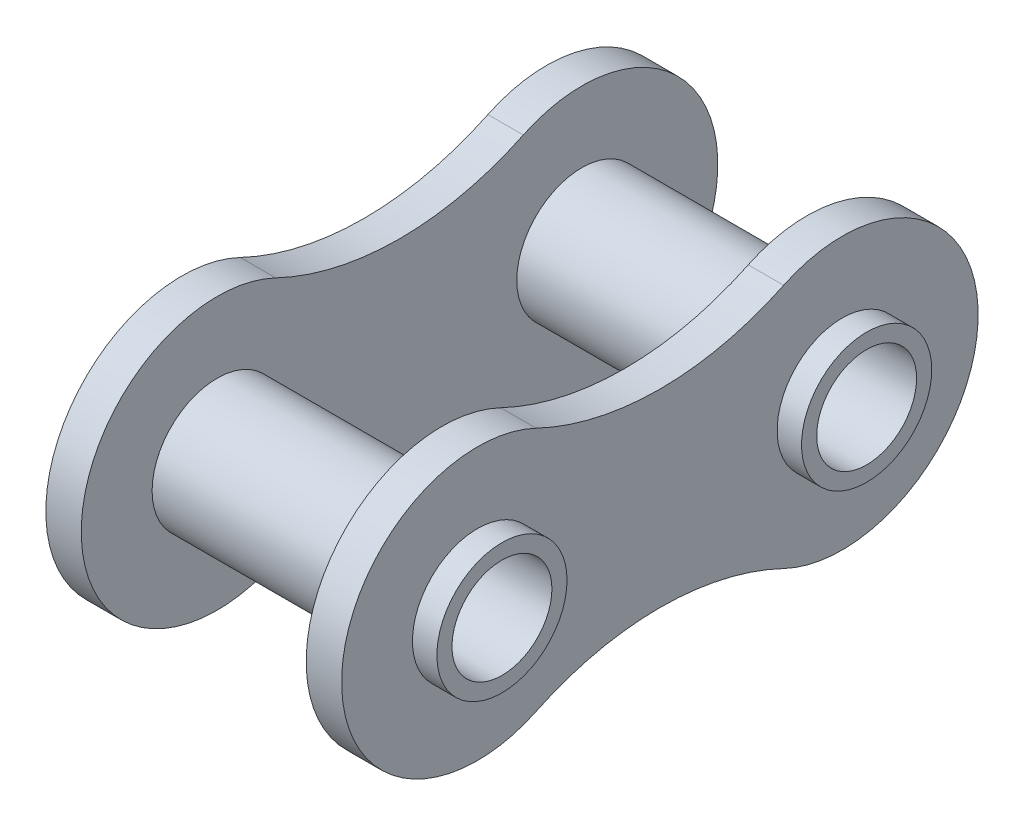
ISO-10303-21;
HEADER;
FILE_DESCRIPTION(('STEP AP214'),'2;1');
FILE_NAME('part.step','',(''),(''),'','','');
FILE_SCHEMA(('AUTOMOTIVE_DESIGN { 1 0 10303 214 1 1 1 1 }'));
ENDSEC;
DATA;
#1=APPLICATION_CONTEXT('core data for automotive mechanical design processes');
#2=APPLICATION_PROTOCOL_DEFINITION('international standard','automotive_design',2000,#1);
#3=PRODUCT_CONTEXT('',#1,'mechanical');
#4=PRODUCT('Part','Part','',(#3));
#5=PRODUCT_RELATED_PRODUCT_CATEGORY('part','',(#4));
#6=PRODUCT_DEFINITION_FORMATION('','',#4);
#7=PRODUCT_DEFINITION_CONTEXT('part definition',#1,'design');
#8=PRODUCT_DEFINITION('design','',#6,#7);
#9=PRODUCT_DEFINITION_SHAPE('','',#8);
#10=(LENGTH_UNIT() NAMED_UNIT(*) SI_UNIT(.MILLI.,.METRE.));
#11=(NAMED_UNIT(*) PLANE_ANGLE_UNIT() SI_UNIT($,.RADIAN.));
#12=(NAMED_UNIT(*) SI_UNIT($,.STERADIAN.) SOLID_ANGLE_UNIT());
#13=UNCERTAINTY_MEASURE_WITH_UNIT(LENGTH_MEASURE(1.E-05),#10,'distance_accuracy_value','');
#14=(GEOMETRIC_REPRESENTATION_CONTEXT(3) GLOBAL_UNCERTAINTY_ASSIGNED_CONTEXT((#13)) GLOBAL_UNIT_ASSIGNED_CONTEXT((#10,
#11,#12)) REPRESENTATION_CONTEXT('',''));
#15=CARTESIAN_POINT('',(0.,0.,0.));
#16=DIRECTION('',(0.,0.,1.));
#17=DIRECTION('',(1.,0.,0.));
#18=AXIS2_PLACEMENT_3D('',#15,#16,#17);
#19=CARTESIAN_POINT('',(18.,0.,19.05));
#20=DIRECTION('',(-1.,0.,0.));
#21=DIRECTION('',(0.,0.,1.));
#22=AXIS2_PLACEMENT_3D('',#19,#20,#21);
#23=CYLINDRICAL_SURFACE('',#22,6.8);
#24=CARTESIAN_POINT('',(11.75,0.,19.05));
#25=DIRECTION('',(1.,0.,0.));
#26=DIRECTION('',(0.,0.,-1.));
#27=AXIS2_PLACEMENT_3D('',#24,#25,#26);
#28=CIRCLE('',#27,6.8);
#29=CARTESIAN_POINT('',(11.75,0.,12.25));
#30=VERTEX_POINT('',#29);
#31=EDGE_CURVE('E215',#30,#30,#28,.T.);
#32=ORIENTED_EDGE('',*,*,#31,.F.);
#33=EDGE_LOOP('',(#32));
#34=FACE_BOUND('',#33,.T.);
#35=CARTESIAN_POINT('',(-11.75,0.,19.05));
#36=DIRECTION('',(-1.,0.,0.));
#37=DIRECTION('',(0.,0.,1.));
#38=AXIS2_PLACEMENT_3D('',#35,#36,#37);
#39=CIRCLE('',#38,6.8);
#40=CARTESIAN_POINT('',(-11.75,0.,25.85));
#41=VERTEX_POINT('',#40);
#42=EDGE_CURVE('E11',#41,#41,#39,.T.);
#43=ORIENTED_EDGE('',*,*,#42,.F.);
#44=EDGE_LOOP('',(#43));
#45=FACE_BOUND('',#44,.T.);
#46=ADVANCED_FACE('F43',(#34,#45),#23,.T.);
#47=CARTESIAN_POINT('',(18.,0.,-19.05));
#48=DIRECTION('',(-1.,0.,0.));
#49=DIRECTION('',(0.,0.,1.));
#50=AXIS2_PLACEMENT_3D('',#47,#48,#49);
#51=CYLINDRICAL_SURFACE('',#50,6.8);
#52=CARTESIAN_POINT('',(11.75,0.,-19.05));
#53=DIRECTION('',(1.,0.,0.));
#54=DIRECTION('',(0.,0.,-1.));
#55=AXIS2_PLACEMENT_3D('',#52,#53,#54);
#56=CIRCLE('',#55,6.8);
#57=CARTESIAN_POINT('',(11.75,0.,-25.85));
#58=VERTEX_POINT('',#57);
#59=EDGE_CURVE('E173',#58,#58,#56,.F.);
#60=ORIENTED_EDGE('',*,*,#59,.T.);
#61=EDGE_LOOP('',(#60));
#62=FACE_BOUND('',#61,.T.);
#63=CARTESIAN_POINT('',(-11.75,0.,-19.05));
#64=DIRECTION('',(-1.,0.,0.));
#65=DIRECTION('',(0.,0.,1.));
#66=AXIS2_PLACEMENT_3D('',#63,#64,#65);
#67=CIRCLE('',#66,6.8);
#68=CARTESIAN_POINT('',(-11.75,0.,-12.25));
#69=VERTEX_POINT('',#68);
#70=EDGE_CURVE('E52',#69,#69,#67,.T.);
#71=ORIENTED_EDGE('',*,*,#70,.F.);
#72=EDGE_LOOP('',(#71));
#73=FACE_BOUND('',#72,.T.);
#74=ADVANCED_FACE('F225',(#62,#73),#51,.T.);
#75=CARTESIAN_POINT('',(-15.45,0.,19.05));
#76=DIRECTION('',(1.,0.,0.));
#77=DIRECTION('',(0.,0.,-1.));
#78=AXIS2_PLACEMENT_3D('',#75,#76,#77);
#79=CIRCLE('',#78,6.8);
#80=CARTESIAN_POINT('',(-15.45,0.,12.25));
#81=VERTEX_POINT('',#80);
#82=EDGE_CURVE('E153',#81,#81,#79,.T.);
#83=ORIENTED_EDGE('',*,*,#82,.F.);
#84=EDGE_LOOP('',(#83));
#85=FACE_BOUND('',#84,.T.);
#86=CARTESIAN_POINT('',(-18.,0.,19.05));
#87=DIRECTION('',(1.,0.,0.));
#88=DIRECTION('',(0.,0.,-1.));
#89=AXIS2_PLACEMENT_3D('',#86,#87,#88);
#90=CIRCLE('',#89,6.8);
#91=CARTESIAN_POINT('',(-18.,0.,12.25));
#92=VERTEX_POINT('',#91);
#93=EDGE_CURVE('E209',#92,#92,#90,.T.);
#94=ORIENTED_EDGE('',*,*,#93,.T.);
#95=EDGE_LOOP('',(#94));
#96=FACE_BOUND('',#95,.T.);
#97=ADVANCED_FACE('F227',(#85,#96),#23,.T.);
#98=CARTESIAN_POINT('',(18.,0.,19.05));
#99=DIRECTION('',(1.,0.,0.));
#100=DIRECTION('',(0.,0.,-1.));
#101=AXIS2_PLACEMENT_3D('',#98,#99,#100);
#102=PLANE('',#101);
#103=CARTESIAN_POINT('',(18.,0.,19.05));
#104=DIRECTION('',(1.,0.,0.));
#105=DIRECTION('',(0.,0.,-1.));
#106=AXIS2_PLACEMENT_3D('',#103,#104,#105);
#107=CIRCLE('',#106,6.8);
#108=CARTESIAN_POINT('',(18.,0.,12.25));
#109=VERTEX_POINT('',#108);
#110=EDGE_CURVE('E212',#109,#109,#107,.T.);
#111=ORIENTED_EDGE('',*,*,#110,.T.);
#112=EDGE_LOOP('',(#111));
#113=FACE_BOUND('',#112,.T.);
#114=CARTESIAN_POINT('',(18.,0.,19.05));
#115=DIRECTION('',(1.,0.,0.));
#116=DIRECTION('',(0.,0.,-1.));
#117=AXIS2_PLACEMENT_3D('',#114,#115,#116);
#118=CIRCLE('',#117,5.22);
#119=CARTESIAN_POINT('',(18.,0.,13.83));
#120=VERTEX_POINT('',#119);
#121=EDGE_CURVE('E206',#120,#120,#118,.T.);
#122=ORIENTED_EDGE('',*,*,#121,.F.);
#123=EDGE_LOOP('',(#122));
#124=FACE_BOUND('',#123,.T.);
#125=ADVANCED_FACE('F236',(#113,#124),#102,.T.);
#126=CARTESIAN_POINT('',(-18.,0.,19.05));
#127=DIRECTION('',(1.,0.,0.));
#128=DIRECTION('',(0.,0.,-1.));
#129=AXIS2_PLACEMENT_3D('',#126,#127,#128);
#130=PLANE('',#129);
#131=ORIENTED_EDGE('',*,*,#93,.F.);
#132=EDGE_LOOP('',(#131));
#133=FACE_BOUND('',#132,.T.);
#134=CARTESIAN_POINT('',(-18.,0.,19.05));
#135=DIRECTION('',(1.,0.,0.));
#136=DIRECTION('',(0.,0.,-1.));
#137=AXIS2_PLACEMENT_3D('',#134,#135,#136);
#138=CIRCLE('',#137,5.22);
#139=CARTESIAN_POINT('',(-18.,0.,13.83));
#140=VERTEX_POINT('',#139);
#141=EDGE_CURVE('E205',#140,#140,#138,.T.);
#142=ORIENTED_EDGE('',*,*,#141,.T.);
#143=EDGE_LOOP('',(#142));
#144=FACE_BOUND('',#143,.T.);
#145=ADVANCED_FACE('F295',(#133,#144),#130,.F.);
#146=CARTESIAN_POINT('',(15.45,0.,19.05));
#147=DIRECTION('',(1.,0.,0.));
#148=DIRECTION('',(0.,0.,-1.));
#149=AXIS2_PLACEMENT_3D('',#146,#147,#148);
#150=CIRCLE('',#149,6.8);
#151=CARTESIAN_POINT('',(15.45,0.,12.25));
#152=VERTEX_POINT('',#151);
#153=EDGE_CURVE('E181',#152,#152,#150,.T.);
#154=ORIENTED_EDGE('',*,*,#153,.T.);
#155=EDGE_LOOP('',(#154));
#156=FACE_BOUND('',#155,.T.);
#157=ORIENTED_EDGE('',*,*,#110,.F.);
#158=EDGE_LOOP('',(#157));
#159=FACE_BOUND('',#158,.T.);
#160=ADVANCED_FACE('F45',(#156,#159),#23,.T.);
#161=CARTESIAN_POINT('',(18.,0.,19.05));
#162=DIRECTION('',(-1.,0.,0.));
#163=DIRECTION('',(0.,0.,1.));
#164=AXIS2_PLACEMENT_3D('',#161,#162,#163);
#165=CYLINDRICAL_SURFACE('',#164,5.22);
#166=ORIENTED_EDGE('',*,*,#121,.T.);
#167=EDGE_LOOP('',(#166));
#168=FACE_BOUND('',#167,.T.);
#169=ORIENTED_EDGE('',*,*,#141,.F.);
#170=EDGE_LOOP('',(#169));
#171=FACE_BOUND('',#170,.T.);
#172=ADVANCED_FACE('F275',(#168,#171),#165,.F.);
#173=CARTESIAN_POINT('',(15.45,-19.9420253484946,9.525));
#174=DIRECTION('',(1.,0.,0.));
#175=DIRECTION('',(0.,0.,-1.));
#176=AXIS2_PLACEMENT_3D('',#173,#174,#175);
#177=PLANE('',#176);
#178=ORIENTED_EDGE('',*,*,#153,.F.);
#179=EDGE_LOOP('',(#178));
#180=FACE_BOUND('',#179,.T.);
#181=CARTESIAN_POINT('',(15.45,-39.8840506969891,0.));
#182=DIRECTION('',(-1.,0.,0.));
#183=DIRECTION('',(0.,0.,-1.));
#184=AXIS2_PLACEMENT_3D('',#181,#182,#183);
#185=CIRCLE('',#184,30.);
#186=CARTESIAN_POINT('',(15.45,-12.8134280519739,12.9298642533937));
#187=VERTEX_POINT('',#186);
#188=CARTESIAN_POINT('',(15.45,-12.8134280519739,-12.9298642533937));
#189=VERTEX_POINT('',#188);
#190=EDGE_CURVE('E185',#187,#189,#185,.T.);
#191=ORIENTED_EDGE('',*,*,#190,.T.);
#192=CARTESIAN_POINT('',(15.45,0.,-19.05));
#193=DIRECTION('',(1.,0.,0.));
#194=DIRECTION('',(0.,0.,-1.));
#195=AXIS2_PLACEMENT_3D('',#192,#193,#194);
#196=CIRCLE('',#195,14.2);
#197=CARTESIAN_POINT('',(15.45,12.8134280519739,-12.9298642533937));
#198=VERTEX_POINT('',#197);
#199=EDGE_CURVE('E92',#189,#198,#196,.T.);
#200=ORIENTED_EDGE('',*,*,#199,.T.);
#201=CARTESIAN_POINT('',(15.45,39.8840506969891,0.));
#202=DIRECTION('',(-1.,0.,0.));
#203=DIRECTION('',(0.,0.,-1.));
#204=AXIS2_PLACEMENT_3D('',#201,#202,#203);
#205=CIRCLE('',#204,30.);
#206=CARTESIAN_POINT('',(15.45,12.8134280519739,12.9298642533937));
#207=VERTEX_POINT('',#206);
#208=EDGE_CURVE('E188',#198,#207,#205,.T.);
#209=ORIENTED_EDGE('',*,*,#208,.T.);
#210=CARTESIAN_POINT('',(15.45,0.,19.05));
#211=DIRECTION('',(1.,0.,0.));
#212=DIRECTION('',(0.,0.,-1.));
#213=AXIS2_PLACEMENT_3D('',#210,#211,#212);
#214=CIRCLE('',#213,14.2);
#215=EDGE_CURVE('E60',#207,#187,#214,.T.);
#216=ORIENTED_EDGE('',*,*,#215,.T.);
#217=EDGE_LOOP('',(#191,#200,#209,#216));
#218=FACE_BOUND('',#217,.T.);
#219=CARTESIAN_POINT('',(15.45,0.,-19.05));
#220=DIRECTION('',(1.,0.,0.));
#221=DIRECTION('',(0.,0.,-1.));
#222=AXIS2_PLACEMENT_3D('',#219,#220,#221);
#223=CIRCLE('',#222,6.8);
#224=CARTESIAN_POINT('',(15.45,0.,-25.85));
#225=VERTEX_POINT('',#224);
#226=EDGE_CURVE('E178',#225,#225,#223,.T.);
#227=ORIENTED_EDGE('',*,*,#226,.F.);
#228=EDGE_LOOP('',(#227));
#229=FACE_BOUND('',#228,.T.);
#230=ADVANCED_FACE('F271',(#180,#218,#229),#177,.T.);
#231=CARTESIAN_POINT('',(11.75,-19.9420253484946,9.525));
#232=DIRECTION('',(1.,0.,0.));
#233=DIRECTION('',(0.,0.,-1.));
#234=AXIS2_PLACEMENT_3D('',#231,#232,#233);
#235=PLANE('',#234);
#236=CARTESIAN_POINT('',(11.75,-39.8840506969891,0.));
#237=DIRECTION('',(-1.,0.,0.));
#238=DIRECTION('',(0.,0.,-1.));
#239=AXIS2_PLACEMENT_3D('',#236,#237,#238);
#240=CIRCLE('',#239,30.);
#241=CARTESIAN_POINT('',(11.75,-12.8134280519739,12.9298642533937));
#242=VERTEX_POINT('',#241);
#243=CARTESIAN_POINT('',(11.75,-12.8134280519739,-12.9298642533937));
#244=VERTEX_POINT('',#243);
#245=EDGE_CURVE('E184',#242,#244,#240,.T.);
#246=ORIENTED_EDGE('',*,*,#245,.F.);
#247=CARTESIAN_POINT('',(11.75,0.,19.05));
#248=DIRECTION('',(1.,0.,0.));
#249=DIRECTION('',(0.,0.,-1.));
#250=AXIS2_PLACEMENT_3D('',#247,#248,#249);
#251=CIRCLE('',#250,14.2);
#252=CARTESIAN_POINT('',(11.75,12.8134280519739,12.9298642533937));
#253=VERTEX_POINT('',#252);
#254=EDGE_CURVE('E84',#253,#242,#251,.T.);
#255=ORIENTED_EDGE('',*,*,#254,.F.);
#256=CARTESIAN_POINT('',(11.75,39.8840506969891,0.));
#257=DIRECTION('',(-1.,0.,0.));
#258=DIRECTION('',(0.,0.,-1.));
#259=AXIS2_PLACEMENT_3D('',#256,#257,#258);
#260=CIRCLE('',#259,30.);
#261=CARTESIAN_POINT('',(11.75,12.8134280519739,-12.9298642533937));
#262=VERTEX_POINT('',#261);
#263=EDGE_CURVE('E78',#262,#253,#260,.T.);
#264=ORIENTED_EDGE('',*,*,#263,.F.);
#265=CARTESIAN_POINT('',(11.75,0.,-19.05));
#266=DIRECTION('',(1.,0.,0.));
#267=DIRECTION('',(0.,0.,-1.));
#268=AXIS2_PLACEMENT_3D('',#265,#266,#267);
#269=CIRCLE('',#268,14.2);
#270=EDGE_CURVE('E194',#244,#262,#269,.T.);
#271=ORIENTED_EDGE('',*,*,#270,.F.);
#272=EDGE_LOOP('',(#246,#255,#264,#271));
#273=FACE_BOUND('',#272,.T.);
#274=ORIENTED_EDGE('',*,*,#31,.T.);
#275=EDGE_LOOP('',(#274));
#276=FACE_BOUND('',#275,.T.);
#277=ORIENTED_EDGE('',*,*,#59,.F.);
#278=EDGE_LOOP('',(#277));
#279=FACE_BOUND('',#278,.T.);
#280=ADVANCED_FACE('F274',(#273,#276,#279),#235,.F.);
#281=CARTESIAN_POINT('',(15.45,-39.8840506969891,0.));
#282=DIRECTION('',(-1.,0.,0.));
#283=DIRECTION('',(0.,0.,1.));
#284=AXIS2_PLACEMENT_3D('',#281,#282,#283);
#285=CYLINDRICAL_SURFACE('',#284,30.);
#286=ORIENTED_EDGE('',*,*,#245,.T.);
#287=DIRECTION('',(-1.,0.,0.));
#288=VECTOR('',#287,1.);
#289=CARTESIAN_POINT('',(15.45,-12.8134280519739,-12.9298642533937));
#290=LINE('',#289,#288);
#291=EDGE_CURVE('E203',#189,#244,#290,.T.);
#292=ORIENTED_EDGE('',*,*,#291,.F.);
#293=ORIENTED_EDGE('',*,*,#190,.F.);
#294=DIRECTION('',(-1.,0.,0.));
#295=VECTOR('',#294,1.);
#296=CARTESIAN_POINT('',(15.45,-12.8134280519739,12.9298642533937));
#297=LINE('',#296,#295);
#298=EDGE_CURVE('E191',#187,#242,#297,.T.);
#299=ORIENTED_EDGE('',*,*,#298,.T.);
#300=EDGE_LOOP('',(#286,#292,#293,#299));
#301=FACE_BOUND('',#300,.T.);
#302=ADVANCED_FACE('F279',(#301),#285,.F.);
#303=CARTESIAN_POINT('',(15.45,0.,-19.05));
#304=DIRECTION('',(-1.,0.,0.));
#305=DIRECTION('',(0.,0.,1.));
#306=AXIS2_PLACEMENT_3D('',#303,#304,#305);
#307=CYLINDRICAL_SURFACE('',#306,14.2);
#308=ORIENTED_EDGE('',*,*,#270,.T.);
#309=DIRECTION('',(-1.,0.,0.));
#310=VECTOR('',#309,1.);
#311=CARTESIAN_POINT('',(15.45,12.8134280519739,-12.9298642533937));
#312=LINE('',#311,#310);
#313=EDGE_CURVE('E201',#198,#262,#312,.T.);
#314=ORIENTED_EDGE('',*,*,#313,.F.);
#315=ORIENTED_EDGE('',*,*,#199,.F.);
#316=ORIENTED_EDGE('',*,*,#291,.T.);
#317=EDGE_LOOP('',(#308,#314,#315,#316));
#318=FACE_BOUND('',#317,.T.);
#319=ADVANCED_FACE('F285',(#318),#307,.T.);
#320=CARTESIAN_POINT('',(15.45,39.8840506969891,0.));
#321=DIRECTION('',(-1.,0.,0.));
#322=DIRECTION('',(0.,0.,1.));
#323=AXIS2_PLACEMENT_3D('',#320,#321,#322);
#324=CYLINDRICAL_SURFACE('',#323,30.);
#325=ORIENTED_EDGE('',*,*,#263,.T.);
#326=DIRECTION('',(-1.,0.,0.));
#327=VECTOR('',#326,1.);
#328=CARTESIAN_POINT('',(15.45,12.8134280519739,12.9298642533937));
#329=LINE('',#328,#327);
#330=EDGE_CURVE('E199',#207,#253,#329,.T.);
#331=ORIENTED_EDGE('',*,*,#330,.F.);
#332=ORIENTED_EDGE('',*,*,#208,.F.);
#333=ORIENTED_EDGE('',*,*,#313,.T.);
#334=EDGE_LOOP('',(#325,#331,#332,#333));
#335=FACE_BOUND('',#334,.T.);
#336=ADVANCED_FACE('F282',(#335),#324,.F.);
#337=CARTESIAN_POINT('',(15.45,0.,19.05));
#338=DIRECTION('',(-1.,0.,0.));
#339=DIRECTION('',(0.,0.,1.));
#340=AXIS2_PLACEMENT_3D('',#337,#338,#339);
#341=CYLINDRICAL_SURFACE('',#340,14.2);
#342=ORIENTED_EDGE('',*,*,#254,.T.);
#343=ORIENTED_EDGE('',*,*,#298,.F.);
#344=ORIENTED_EDGE('',*,*,#215,.F.);
#345=ORIENTED_EDGE('',*,*,#330,.T.);
#346=EDGE_LOOP('',(#342,#343,#344,#345));
#347=FACE_BOUND('',#346,.T.);
#348=ADVANCED_FACE('F243',(#347),#341,.T.);
#349=CARTESIAN_POINT('',(-15.45,0.,-19.05));
#350=DIRECTION('',(1.,0.,0.));
#351=DIRECTION('',(0.,0.,-1.));
#352=AXIS2_PLACEMENT_3D('',#349,#350,#351);
#353=CIRCLE('',#352,6.8);
#354=CARTESIAN_POINT('',(-15.45,0.,-25.85));
#355=VERTEX_POINT('',#354);
#356=EDGE_CURVE('E386',#355,#355,#353,.T.);
#357=ORIENTED_EDGE('',*,*,#356,.F.);
#358=EDGE_LOOP('',(#357));
#359=FACE_BOUND('',#358,.T.);
#360=CARTESIAN_POINT('',(-18.,0.,-19.05));
#361=DIRECTION('',(1.,0.,0.));
#362=DIRECTION('',(0.,0.,-1.));
#363=AXIS2_PLACEMENT_3D('',#360,#361,#362);
#364=CIRCLE('',#363,6.8);
#365=CARTESIAN_POINT('',(-18.,0.,-25.85));
#366=VERTEX_POINT('',#365);
#367=EDGE_CURVE('E164',#366,#366,#364,.T.);
#368=ORIENTED_EDGE('',*,*,#367,.T.);
#369=EDGE_LOOP('',(#368));
#370=FACE_BOUND('',#369,.T.);
#371=ADVANCED_FACE('F230',(#359,#370),#51,.T.);
#372=CARTESIAN_POINT('',(18.,0.,-19.05));
#373=DIRECTION('',(1.,0.,0.));
#374=DIRECTION('',(0.,0.,-1.));
#375=AXIS2_PLACEMENT_3D('',#372,#373,#374);
#376=PLANE('',#375);
#377=CARTESIAN_POINT('',(18.,0.,-19.05));
#378=DIRECTION('',(1.,0.,0.));
#379=DIRECTION('',(0.,0.,-1.));
#380=AXIS2_PLACEMENT_3D('',#377,#378,#379);
#381=CIRCLE('',#380,6.8);
#382=CARTESIAN_POINT('',(18.,0.,-25.85));
#383=VERTEX_POINT('',#382);
#384=EDGE_CURVE('E130',#383,#383,#381,.T.);
#385=ORIENTED_EDGE('',*,*,#384,.T.);
#386=EDGE_LOOP('',(#385));
#387=FACE_BOUND('',#386,.T.);
#388=CARTESIAN_POINT('',(18.,0.,-19.05));
#389=DIRECTION('',(1.,0.,0.));
#390=DIRECTION('',(0.,0.,-1.));
#391=AXIS2_PLACEMENT_3D('',#388,#389,#390);
#392=CIRCLE('',#391,5.22);
#393=CARTESIAN_POINT('',(18.,0.,-24.27));
#394=VERTEX_POINT('',#393);
#395=EDGE_CURVE('E167',#394,#394,#392,.T.);
#396=ORIENTED_EDGE('',*,*,#395,.F.);
#397=EDGE_LOOP('',(#396));
#398=FACE_BOUND('',#397,.T.);
#399=ADVANCED_FACE('F242',(#387,#398),#376,.T.);
#400=CARTESIAN_POINT('',(-18.,0.,-19.05));
#401=DIRECTION('',(1.,0.,0.));
#402=DIRECTION('',(0.,0.,-1.));
#403=AXIS2_PLACEMENT_3D('',#400,#401,#402);
#404=PLANE('',#403);
#405=ORIENTED_EDGE('',*,*,#367,.F.);
#406=EDGE_LOOP('',(#405));
#407=FACE_BOUND('',#406,.T.);
#408=CARTESIAN_POINT('',(-18.,0.,-19.05));
#409=DIRECTION('',(1.,0.,0.));
#410=DIRECTION('',(0.,0.,-1.));
#411=AXIS2_PLACEMENT_3D('',#408,#409,#410);
#412=CIRCLE('',#411,5.22);
#413=CARTESIAN_POINT('',(-18.,0.,-24.27));
#414=VERTEX_POINT('',#413);
#415=EDGE_CURVE('E170',#414,#414,#412,.T.);
#416=ORIENTED_EDGE('',*,*,#415,.T.);
#417=EDGE_LOOP('',(#416));
#418=FACE_BOUND('',#417,.T.);
#419=ADVANCED_FACE('F247',(#407,#418),#404,.F.);
#420=ORIENTED_EDGE('',*,*,#226,.T.);
#421=EDGE_LOOP('',(#420));
#422=FACE_BOUND('',#421,.T.);
#423=ORIENTED_EDGE('',*,*,#384,.F.);
#424=EDGE_LOOP('',(#423));
#425=FACE_BOUND('',#424,.T.);
#426=ADVANCED_FACE('F231',(#422,#425),#51,.T.);
#427=CARTESIAN_POINT('',(18.,0.,-19.05));
#428=DIRECTION('',(-1.,0.,0.));
#429=DIRECTION('',(0.,0.,1.));
#430=AXIS2_PLACEMENT_3D('',#427,#428,#429);
#431=CYLINDRICAL_SURFACE('',#430,5.22);
#432=ORIENTED_EDGE('',*,*,#395,.T.);
#433=EDGE_LOOP('',(#432));
#434=FACE_BOUND('',#433,.T.);
#435=ORIENTED_EDGE('',*,*,#415,.F.);
#436=EDGE_LOOP('',(#435));
#437=FACE_BOUND('',#436,.T.);
#438=ADVANCED_FACE('F246',(#434,#437),#431,.F.);
#439=CARTESIAN_POINT('',(-15.45,-39.8840506969891,0.));
#440=DIRECTION('',(1.,0.,0.));
#441=DIRECTION('',(0.,0.,-1.));
#442=AXIS2_PLACEMENT_3D('',#439,#440,#441);
#443=CYLINDRICAL_SURFACE('',#442,30.);
#444=CARTESIAN_POINT('',(-11.75,-39.8840506969891,0.));
#445=DIRECTION('',(-1.,0.,0.));
#446=DIRECTION('',(0.,0.,-1.));
#447=AXIS2_PLACEMENT_3D('',#444,#445,#446);
#448=CIRCLE('',#447,30.);
#449=CARTESIAN_POINT('',(-11.75,-12.8134280519739,12.9298642533937));
#450=VERTEX_POINT('',#449);
#451=CARTESIAN_POINT('',(-11.75,-12.8134280519739,-12.9298642533937));
#452=VERTEX_POINT('',#451);
#453=EDGE_CURVE('E125',#450,#452,#448,.T.);
#454=ORIENTED_EDGE('',*,*,#453,.F.);
#455=DIRECTION('',(1.,0.,0.));
#456=VECTOR('',#455,1.);
#457=CARTESIAN_POINT('',(-15.45,-12.8134280519739,12.9298642533937));
#458=LINE('',#457,#456);
#459=CARTESIAN_POINT('',(-15.45,-12.8134280519739,12.9298642533937));
#460=VERTEX_POINT('',#459);
#461=EDGE_CURVE('E119',#460,#450,#458,.T.);
#462=ORIENTED_EDGE('',*,*,#461,.F.);
#463=CARTESIAN_POINT('',(-15.45,-39.8840506969891,0.));
#464=DIRECTION('',(-1.,0.,0.));
#465=DIRECTION('',(0.,0.,-1.));
#466=AXIS2_PLACEMENT_3D('',#463,#464,#465);
#467=CIRCLE('',#466,30.);
#468=CARTESIAN_POINT('',(-15.45,-12.8134280519739,-12.9298642533937));
#469=VERTEX_POINT('',#468);
#470=EDGE_CURVE('E122',#460,#469,#467,.T.);
#471=ORIENTED_EDGE('',*,*,#470,.T.);
#472=DIRECTION('',(1.,0.,0.));
#473=VECTOR('',#472,1.);
#474=CARTESIAN_POINT('',(-15.45,-12.8134280519739,-12.9298642533937));
#475=LINE('',#474,#473);
#476=EDGE_CURVE('E150',#469,#452,#475,.T.);
#477=ORIENTED_EDGE('',*,*,#476,.T.);
#478=EDGE_LOOP('',(#454,#462,#471,#477));
#479=FACE_BOUND('',#478,.T.);
#480=ADVANCED_FACE('F121',(#479),#443,.F.);
#481=CARTESIAN_POINT('',(-15.45,0.,19.05));
#482=DIRECTION('',(1.,0.,0.));
#483=DIRECTION('',(0.,0.,-1.));
#484=AXIS2_PLACEMENT_3D('',#481,#482,#483);
#485=CYLINDRICAL_SURFACE('',#484,14.2);
#486=CARTESIAN_POINT('',(-11.75,0.,19.05));
#487=DIRECTION('',(1.,0.,0.));
#488=DIRECTION('',(0.,0.,-1.));
#489=AXIS2_PLACEMENT_3D('',#486,#487,#488);
#490=CIRCLE('',#489,14.2);
#491=CARTESIAN_POINT('',(-11.75,12.8134280519739,12.9298642533937));
#492=VERTEX_POINT('',#491);
#493=EDGE_CURVE('E152',#492,#450,#490,.T.);
#494=ORIENTED_EDGE('',*,*,#493,.F.);
#495=DIRECTION('',(1.,0.,0.));
#496=VECTOR('',#495,1.);
#497=CARTESIAN_POINT('',(-15.45,12.8134280519739,12.9298642533937));
#498=LINE('',#497,#496);
#499=CARTESIAN_POINT('',(-15.45,12.8134280519739,12.9298642533937));
#500=VERTEX_POINT('',#499);
#501=EDGE_CURVE('E131',#500,#492,#498,.T.);
#502=ORIENTED_EDGE('',*,*,#501,.F.);
#503=CARTESIAN_POINT('',(-15.45,0.,19.05));
#504=DIRECTION('',(1.,0.,0.));
#505=DIRECTION('',(0.,0.,-1.));
#506=AXIS2_PLACEMENT_3D('',#503,#504,#505);
#507=CIRCLE('',#506,14.2);
#508=EDGE_CURVE('E137',#500,#460,#507,.T.);
#509=ORIENTED_EDGE('',*,*,#508,.T.);
#510=ORIENTED_EDGE('',*,*,#461,.T.);
#511=EDGE_LOOP('',(#494,#502,#509,#510));
#512=FACE_BOUND('',#511,.T.);
#513=ADVANCED_FACE('F143',(#512),#485,.T.);
#514=CARTESIAN_POINT('',(-15.45,39.8840506969891,0.));
#515=DIRECTION('',(1.,0.,0.));
#516=DIRECTION('',(0.,0.,-1.));
#517=AXIS2_PLACEMENT_3D('',#514,#515,#516);
#518=CYLINDRICAL_SURFACE('',#517,30.);
#519=CARTESIAN_POINT('',(-11.75,39.8840506969891,0.));
#520=DIRECTION('',(-1.,0.,0.));
#521=DIRECTION('',(0.,0.,-1.));
#522=AXIS2_PLACEMENT_3D('',#519,#520,#521);
#523=CIRCLE('',#522,30.);
#524=CARTESIAN_POINT('',(-11.75,12.8134280519739,-12.9298642533937));
#525=VERTEX_POINT('',#524);
#526=EDGE_CURVE('E155',#525,#492,#523,.T.);
#527=ORIENTED_EDGE('',*,*,#526,.F.);
#528=DIRECTION('',(1.,0.,0.));
#529=VECTOR('',#528,1.);
#530=CARTESIAN_POINT('',(-15.45,12.8134280519739,-12.9298642533937));
#531=LINE('',#530,#529);
#532=CARTESIAN_POINT('',(-15.45,12.8134280519739,-12.9298642533937));
#533=VERTEX_POINT('',#532);
#534=EDGE_CURVE('E161',#533,#525,#531,.T.);
#535=ORIENTED_EDGE('',*,*,#534,.F.);
#536=CARTESIAN_POINT('',(-15.45,39.8840506969891,0.));
#537=DIRECTION('',(-1.,0.,0.));
#538=DIRECTION('',(0.,0.,-1.));
#539=AXIS2_PLACEMENT_3D('',#536,#537,#538);
#540=CIRCLE('',#539,30.);
#541=EDGE_CURVE('E144',#533,#500,#540,.T.);
#542=ORIENTED_EDGE('',*,*,#541,.T.);
#543=ORIENTED_EDGE('',*,*,#501,.T.);
#544=EDGE_LOOP('',(#527,#535,#542,#543));
#545=FACE_BOUND('',#544,.T.);
#546=ADVANCED_FACE('F334',(#545),#518,.F.);
#547=CARTESIAN_POINT('',(-15.45,0.,-19.05));
#548=DIRECTION('',(1.,0.,0.));
#549=DIRECTION('',(0.,0.,-1.));
#550=AXIS2_PLACEMENT_3D('',#547,#548,#549);
#551=CYLINDRICAL_SURFACE('',#550,14.2);
#552=CARTESIAN_POINT('',(-11.75,0.,-19.05));
#553=DIRECTION('',(1.,0.,0.));
#554=DIRECTION('',(0.,0.,-1.));
#555=AXIS2_PLACEMENT_3D('',#552,#553,#554);
#556=CIRCLE('',#555,14.2);
#557=EDGE_CURVE('E141',#452,#525,#556,.T.);
#558=ORIENTED_EDGE('',*,*,#557,.F.);
#559=ORIENTED_EDGE('',*,*,#476,.F.);
#560=CARTESIAN_POINT('',(-15.45,0.,-19.05));
#561=DIRECTION('',(1.,0.,0.));
#562=DIRECTION('',(0.,0.,-1.));
#563=AXIS2_PLACEMENT_3D('',#560,#561,#562);
#564=CIRCLE('',#563,14.2);
#565=EDGE_CURVE('E140',#469,#533,#564,.T.);
#566=ORIENTED_EDGE('',*,*,#565,.T.);
#567=ORIENTED_EDGE('',*,*,#534,.T.);
#568=EDGE_LOOP('',(#558,#559,#566,#567));
#569=FACE_BOUND('',#568,.T.);
#570=ADVANCED_FACE('F331',(#569),#551,.T.);
#571=CARTESIAN_POINT('',(-15.45,-19.9420253484946,9.525));
#572=DIRECTION('',(-1.,0.,0.));
#573=DIRECTION('',(0.,0.,-1.));
#574=AXIS2_PLACEMENT_3D('',#571,#572,#573);
#575=PLANE('',#574);
#576=ORIENTED_EDGE('',*,*,#356,.T.);
#577=EDGE_LOOP('',(#576));
#578=FACE_BOUND('',#577,.T.);
#579=ORIENTED_EDGE('',*,*,#82,.T.);
#580=EDGE_LOOP('',(#579));
#581=FACE_BOUND('',#580,.T.);
#582=ORIENTED_EDGE('',*,*,#470,.F.);
#583=ORIENTED_EDGE('',*,*,#508,.F.);
#584=ORIENTED_EDGE('',*,*,#541,.F.);
#585=ORIENTED_EDGE('',*,*,#565,.F.);
#586=EDGE_LOOP('',(#582,#583,#584,#585));
#587=FACE_BOUND('',#586,.T.);
#588=ADVANCED_FACE('F135',(#578,#581,#587),#575,.T.);
#589=CARTESIAN_POINT('',(-11.75,-19.9420253484946,9.525));
#590=DIRECTION('',(-1.,0.,0.));
#591=DIRECTION('',(0.,0.,-1.));
#592=AXIS2_PLACEMENT_3D('',#589,#590,#591);
#593=PLANE('',#592);
#594=ORIENTED_EDGE('',*,*,#70,.T.);
#595=EDGE_LOOP('',(#594));
#596=FACE_BOUND('',#595,.T.);
#597=ORIENTED_EDGE('',*,*,#42,.T.);
#598=EDGE_LOOP('',(#597));
#599=FACE_BOUND('',#598,.T.);
#600=ORIENTED_EDGE('',*,*,#453,.T.);
#601=ORIENTED_EDGE('',*,*,#557,.T.);
#602=ORIENTED_EDGE('',*,*,#526,.T.);
#603=ORIENTED_EDGE('',*,*,#493,.T.);
#604=EDGE_LOOP('',(#600,#601,#602,#603));
#605=FACE_BOUND('',#604,.T.);
#606=ADVANCED_FACE('F222',(#596,#599,#605),#593,.F.);
#607=CLOSED_SHELL('',(#46,#74,#97,#125,#145,#160,#172,#230,#280,#302,#319,#336,#348,#371,#399,
#419,#426,#438,#480,#513,#546,#570,#588,#606));
#608=MANIFOLD_SOLID_BREP('B2',#607);
#609=ADVANCED_BREP_SHAPE_REPRESENTATION('',(#18,#608),#14);
#610=SHAPE_DEFINITION_REPRESENTATION(#9,#609);
ENDSEC;
END-ISO-10303-21;
